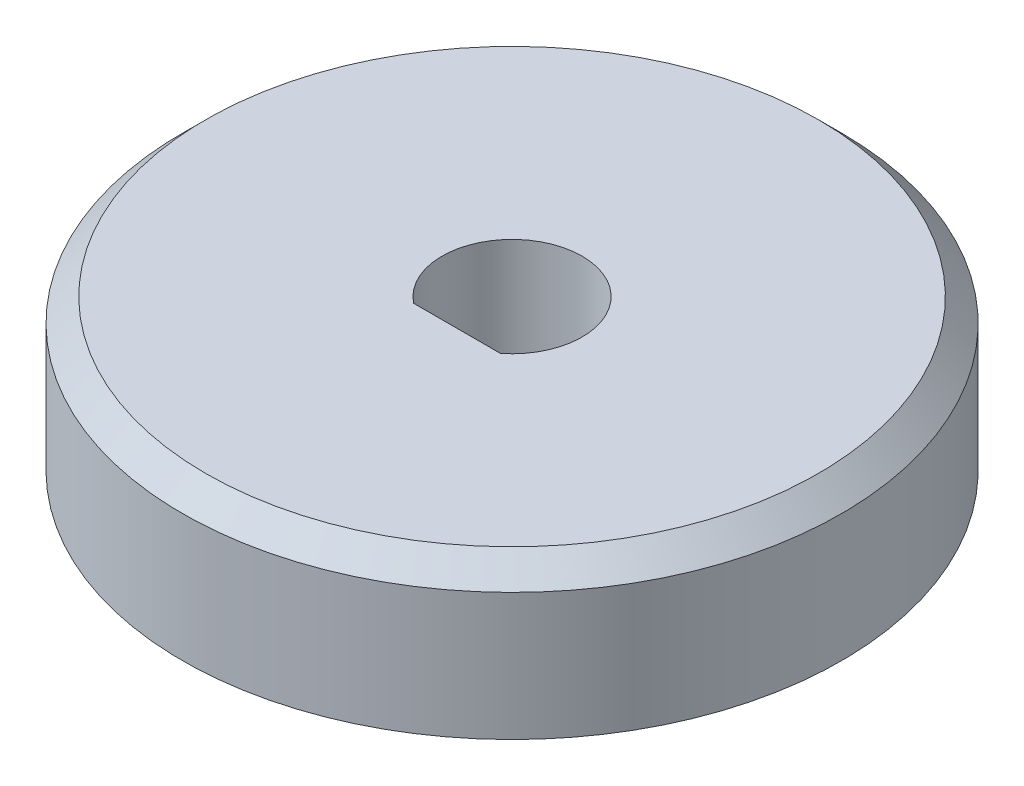
ISO-10303-21;
HEADER;
FILE_DESCRIPTION(('STEP AP214'),'2;1');
FILE_NAME('part.step','',(''),(''),'','','');
FILE_SCHEMA(('AUTOMOTIVE_DESIGN { 1 0 10303 214 1 1 1 1 }'));
ENDSEC;
DATA;
#1=APPLICATION_CONTEXT('core data for automotive mechanical design processes');
#2=APPLICATION_PROTOCOL_DEFINITION('international standard','automotive_design',2000,#1);
#3=PRODUCT_CONTEXT('',#1,'mechanical');
#4=PRODUCT('Part','Part','',(#3));
#5=PRODUCT_RELATED_PRODUCT_CATEGORY('part','',(#4));
#6=PRODUCT_DEFINITION_FORMATION('','',#4);
#7=PRODUCT_DEFINITION_CONTEXT('part definition',#1,'design');
#8=PRODUCT_DEFINITION('design','',#6,#7);
#9=PRODUCT_DEFINITION_SHAPE('','',#8);
#10=(LENGTH_UNIT() NAMED_UNIT(*) SI_UNIT(.MILLI.,.METRE.));
#11=(NAMED_UNIT(*) PLANE_ANGLE_UNIT() SI_UNIT($,.RADIAN.));
#12=(NAMED_UNIT(*) SI_UNIT($,.STERADIAN.) SOLID_ANGLE_UNIT());
#13=UNCERTAINTY_MEASURE_WITH_UNIT(LENGTH_MEASURE(1.E-05),#10,'distance_accuracy_value','');
#14=(GEOMETRIC_REPRESENTATION_CONTEXT(3) GLOBAL_UNCERTAINTY_ASSIGNED_CONTEXT((#13)) GLOBAL_UNIT_ASSIGNED_CONTEXT((#10,
#11,#12)) REPRESENTATION_CONTEXT('',''));
#15=CARTESIAN_POINT('',(0.,0.,0.));
#16=DIRECTION('',(0.,0.,1.));
#17=DIRECTION('',(1.,0.,0.));
#18=AXIS2_PLACEMENT_3D('',#15,#16,#17);
#19=CARTESIAN_POINT('',(0.,6.5,0.));
#20=DIRECTION('',(0.,1.,0.));
#21=DIRECTION('',(0.,0.,1.));
#22=AXIS2_PLACEMENT_3D('',#19,#20,#21);
#23=PLANE('',#22);
#24=CARTESIAN_POINT('',(0.,6.5,0.));
#25=DIRECTION('',(0.,1.,0.));
#26=DIRECTION('',(0.,0.,1.));
#27=AXIS2_PLACEMENT_3D('',#24,#25,#26);
#28=CIRCLE('',#27,13.225);
#29=CARTESIAN_POINT('',(0.,6.5,13.225));
#30=VERTEX_POINT('',#29);
#31=EDGE_CURVE('E41',#30,#30,#28,.T.);
#32=ORIENTED_EDGE('',*,*,#31,.T.);
#33=EDGE_LOOP('',(#32));
#34=FACE_BOUND('',#33,.T.);
#35=DIRECTION('',(1.,0.,0.));
#36=VECTOR('',#35,1.);
#37=CARTESIAN_POINT('',(-1.87349939951952,6.5,2.375));
#38=LINE('',#37,#36);
#39=CARTESIAN_POINT('',(-1.87349939951952,6.5,2.375));
#40=VERTEX_POINT('',#39);
#41=CARTESIAN_POINT('',(1.87349939951952,6.5,2.375));
#42=VERTEX_POINT('',#41);
#43=EDGE_CURVE('E75',#40,#42,#38,.T.);
#44=ORIENTED_EDGE('',*,*,#43,.F.);
#45=CARTESIAN_POINT('',(0.,6.5,0.));
#46=DIRECTION('',(0.,1.,0.));
#47=DIRECTION('',(0.,0.,1.));
#48=AXIS2_PLACEMENT_3D('',#45,#46,#47);
#49=CIRCLE('',#48,3.025);
#50=EDGE_CURVE('E65',#42,#40,#49,.T.);
#51=ORIENTED_EDGE('',*,*,#50,.F.);
#52=EDGE_LOOP('',(#44,#51));
#53=FACE_BOUND('',#52,.T.);
#54=ADVANCED_FACE('F33',(#34,#53),#23,.T.);
#55=CARTESIAN_POINT('',(0.,0.,0.));
#56=DIRECTION('',(0.,1.,0.));
#57=DIRECTION('',(0.,0.,1.));
#58=AXIS2_PLACEMENT_3D('',#55,#56,#57);
#59=PLANE('',#58);
#60=CARTESIAN_POINT('',(0.,0.,0.));
#61=DIRECTION('',(0.,1.,0.));
#62=DIRECTION('',(0.,0.,1.));
#63=AXIS2_PLACEMENT_3D('',#60,#61,#62);
#64=CIRCLE('',#63,14.225);
#65=CARTESIAN_POINT('',(0.,0.,-14.225));
#66=VERTEX_POINT('',#65);
#67=EDGE_CURVE('E70',#66,#66,#64,.T.);
#68=ORIENTED_EDGE('',*,*,#67,.F.);
#69=EDGE_LOOP('',(#68));
#70=FACE_BOUND('',#69,.T.);
#71=CARTESIAN_POINT('',(0.,0.,0.));
#72=DIRECTION('',(0.,1.,0.));
#73=DIRECTION('',(0.,0.,1.));
#74=AXIS2_PLACEMENT_3D('',#71,#72,#73);
#75=CIRCLE('',#74,3.025);
#76=CARTESIAN_POINT('',(1.87349939951952,0.,2.375));
#77=VERTEX_POINT('',#76);
#78=CARTESIAN_POINT('',(-1.87349939951952,0.,2.375));
#79=VERTEX_POINT('',#78);
#80=EDGE_CURVE('E55',#77,#79,#75,.T.);
#81=ORIENTED_EDGE('',*,*,#80,.T.);
#82=DIRECTION('',(1.,0.,0.));
#83=VECTOR('',#82,1.);
#84=CARTESIAN_POINT('',(-1.87349939951952,0.,2.375));
#85=LINE('',#84,#83);
#86=EDGE_CURVE('E61',#79,#77,#85,.T.);
#87=ORIENTED_EDGE('',*,*,#86,.T.);
#88=EDGE_LOOP('',(#81,#87));
#89=FACE_BOUND('',#88,.T.);
#90=ADVANCED_FACE('F72',(#70,#89),#59,.F.);
#91=CARTESIAN_POINT('',(0.,6.5,0.));
#92=DIRECTION('',(0.,-1.,0.));
#93=DIRECTION('',(0.,0.,-1.));
#94=AXIS2_PLACEMENT_3D('',#91,#92,#93);
#95=CYLINDRICAL_SURFACE('',#94,14.225);
#96=CARTESIAN_POINT('',(0.,5.50000000000001,0.));
#97=DIRECTION('',(0.,1.,0.));
#98=DIRECTION('',(0.,0.,1.));
#99=AXIS2_PLACEMENT_3D('',#96,#97,#98);
#100=CIRCLE('',#99,14.225);
#101=CARTESIAN_POINT('',(0.,5.50000000000001,-14.225));
#102=VERTEX_POINT('',#101);
#103=EDGE_CURVE('E11',#102,#102,#100,.F.);
#104=CARTESIAN_POINT('',(0.,5.50000000000001,-14.225));
#105=CARTESIAN_POINT('',(0.,5.44270833333334,-14.225));
#106=CARTESIAN_POINT('',(0.,5.38541666666667,-14.225));
#107=CARTESIAN_POINT('',(0.,5.27083333333334,-14.225));
#108=CARTESIAN_POINT('',(0.,5.21354166666667,-14.225));
#109=CARTESIAN_POINT('',(0.,5.09895833333334,-14.225));
#110=CARTESIAN_POINT('',(0.,5.04166666666667,-14.225));
#111=CARTESIAN_POINT('',(0.,4.92708333333334,-14.225));
#112=CARTESIAN_POINT('',(0.,4.86979166666667,-14.225));
#113=CARTESIAN_POINT('',(0.,4.75520833333334,-14.225));
#114=CARTESIAN_POINT('',(0.,4.69791666666667,-14.225));
#115=CARTESIAN_POINT('',(0.,4.58333333333334,-14.225));
#116=CARTESIAN_POINT('',(0.,4.52604166666667,-14.225));
#117=CARTESIAN_POINT('',(0.,4.41145833333334,-14.225));
#118=CARTESIAN_POINT('',(0.,4.35416666666667,-14.225));
#119=CARTESIAN_POINT('',(0.,4.23958333333334,-14.225));
#120=CARTESIAN_POINT('',(0.,4.18229166666667,-14.225));
#121=CARTESIAN_POINT('',(0.,4.06770833333334,-14.225));
#122=CARTESIAN_POINT('',(0.,4.01041666666667,-14.225));
#123=CARTESIAN_POINT('',(0.,3.89583333333334,-14.225));
#124=CARTESIAN_POINT('',(0.,3.83854166666667,-14.225));
#125=CARTESIAN_POINT('',(0.,3.72395833333334,-14.225));
#126=CARTESIAN_POINT('',(0.,3.66666666666667,-14.225));
#127=CARTESIAN_POINT('',(0.,3.55208333333334,-14.225));
#128=CARTESIAN_POINT('',(0.,3.49479166666667,-14.225));
#129=CARTESIAN_POINT('',(0.,3.38020833333334,-14.225));
#130=CARTESIAN_POINT('',(0.,3.32291666666667,-14.225));
#131=CARTESIAN_POINT('',(0.,3.20833333333334,-14.225));
#132=CARTESIAN_POINT('',(0.,3.15104166666667,-14.225));
#133=CARTESIAN_POINT('',(0.,3.03645833333334,-14.225));
#134=CARTESIAN_POINT('',(0.,2.97916666666667,-14.225));
#135=CARTESIAN_POINT('',(0.,2.86458333333334,-14.225));
#136=CARTESIAN_POINT('',(0.,2.80729166666667,-14.225));
#137=CARTESIAN_POINT('',(0.,2.69270833333334,-14.225));
#138=CARTESIAN_POINT('',(0.,2.63541666666667,-14.225));
#139=CARTESIAN_POINT('',(0.,2.52083333333334,-14.225));
#140=CARTESIAN_POINT('',(0.,2.46354166666667,-14.225));
#141=CARTESIAN_POINT('',(0.,2.34895833333334,-14.225));
#142=CARTESIAN_POINT('',(0.,2.29166666666667,-14.225));
#143=CARTESIAN_POINT('',(0.,2.17708333333334,-14.225));
#144=CARTESIAN_POINT('',(0.,2.11979166666667,-14.225));
#145=CARTESIAN_POINT('',(0.,2.00520833333334,-14.225));
#146=CARTESIAN_POINT('',(0.,1.94791666666667,-14.225));
#147=CARTESIAN_POINT('',(0.,1.83333333333334,-14.225));
#148=CARTESIAN_POINT('',(0.,1.77604166666667,-14.225));
#149=CARTESIAN_POINT('',(0.,1.66145833333333,-14.225));
#150=CARTESIAN_POINT('',(0.,1.60416666666667,-14.225));
#151=CARTESIAN_POINT('',(0.,1.48958333333333,-14.225));
#152=CARTESIAN_POINT('',(0.,1.43229166666667,-14.225));
#153=CARTESIAN_POINT('',(0.,1.31770833333333,-14.225));
#154=CARTESIAN_POINT('',(0.,1.26041666666667,-14.225));
#155=CARTESIAN_POINT('',(0.,1.14583333333333,-14.225));
#156=CARTESIAN_POINT('',(0.,1.08854166666667,-14.225));
#157=CARTESIAN_POINT('',(0.,0.973958333333334,-14.225));
#158=CARTESIAN_POINT('',(0.,0.916666666666668,-14.225));
#159=CARTESIAN_POINT('',(0.,0.802083333333334,-14.225));
#160=CARTESIAN_POINT('',(0.,0.744791666666667,-14.225));
#161=CARTESIAN_POINT('',(0.,0.630208333333334,-14.225));
#162=CARTESIAN_POINT('',(0.,0.572916666666667,-14.225));
#163=CARTESIAN_POINT('',(0.,0.458333333333334,-14.225));
#164=CARTESIAN_POINT('',(0.,0.401041666666667,-14.225));
#165=CARTESIAN_POINT('',(0.,0.286458333333334,-14.225));
#166=CARTESIAN_POINT('',(0.,0.229166666666667,-14.225));
#167=CARTESIAN_POINT('',(0.,0.114583333333333,-14.225));
#168=CARTESIAN_POINT('',(0.,0.0572916666666668,-14.225));
#169=CARTESIAN_POINT('',(0.,0.,-14.225));
#170=B_SPLINE_CURVE_WITH_KNOTS('',3,(#104,#105,#106,#107,#108,#109,#110,#111,#112,#113,#114,
#115,#116,#117,#118,#119,#120,#121,#122,#123,#124,#125,#126,#127,#128,#129,#130,#131,#132,#133,
#134,#135,#136,#137,#138,#139,#140,#141,#142,#143,#144,#145,#146,#147,#148,#149,#150,#151,#152,
#153,#154,#155,#156,#157,#158,#159,#160,#161,#162,#163,#164,#165,#166,#167,#168,#169),
.UNSPECIFIED.,.F.,.F.,(4,2,2,2,2,2,2,2,2,2,2,2,2,2,2,2,2,2,2,2,2,2,2,2,2,2,2,2,2,2,2,2,4),(0.,
0.171875,0.343750000000001,0.515625000000001,0.687500000000001,0.859375000000002,1.03125,
1.203125,1.375,1.546875,1.71875,1.890625,2.0625,2.234375,2.40625,2.578125,2.75,2.921875,3.09375,
3.265625,3.4375,3.609375,3.78125000000001,3.95312500000001,4.12500000000001,4.29687500000001,
4.46875000000001,4.64062500000001,4.81250000000001,4.98437500000001,5.15625000000001,
5.32812500000001,5.50000000000001),.UNSPECIFIED.);
#171=EDGE_CURVE('BSEAM97',#102,#66,#170,.T.);
#172=ORIENTED_EDGE('',*,*,#103,.T.);
#173=ORIENTED_EDGE('',*,*,#67,.T.);
#174=ORIENTED_EDGE('',*,*,#171,.T.);
#175=ORIENTED_EDGE('',*,*,#171,.F.);
#176=EDGE_LOOP('',(#172,#174,#173,#175));
#177=FACE_BOUND('',#176,.T.);
#178=ADVANCED_FACE('F97',(#177),#95,.T.);
#179=CARTESIAN_POINT('',(0.,6.5,0.));
#180=DIRECTION('',(0.,-1.,0.));
#181=DIRECTION('',(0.,0.,-1.));
#182=AXIS2_PLACEMENT_3D('',#179,#180,#181);
#183=CYLINDRICAL_SURFACE('',#182,3.025);
#184=ORIENTED_EDGE('',*,*,#80,.F.);
#185=DIRECTION('',(0.,-1.,0.));
#186=VECTOR('',#185,1.);
#187=CARTESIAN_POINT('',(1.87349939951952,6.5,2.375));
#188=LINE('',#187,#186);
#189=EDGE_CURVE('E63',#42,#77,#188,.T.);
#190=ORIENTED_EDGE('',*,*,#189,.F.);
#191=ORIENTED_EDGE('',*,*,#50,.T.);
#192=DIRECTION('',(0.,-1.,0.));
#193=VECTOR('',#192,1.);
#194=CARTESIAN_POINT('',(-1.87349939951952,6.5,2.375));
#195=LINE('',#194,#193);
#196=EDGE_CURVE('E48',#40,#79,#195,.T.);
#197=ORIENTED_EDGE('',*,*,#196,.T.);
#198=EDGE_LOOP('',(#184,#190,#191,#197));
#199=FACE_BOUND('',#198,.T.);
#200=ADVANCED_FACE('F67',(#199),#183,.F.);
#201=CARTESIAN_POINT('',(-1.87349939951952,6.5,2.375));
#202=DIRECTION('',(0.,0.,-1.));
#203=DIRECTION('',(-1.,0.,0.));
#204=AXIS2_PLACEMENT_3D('',#201,#202,#203);
#205=PLANE('',#204);
#206=ORIENTED_EDGE('',*,*,#86,.F.);
#207=ORIENTED_EDGE('',*,*,#196,.F.);
#208=ORIENTED_EDGE('',*,*,#43,.T.);
#209=ORIENTED_EDGE('',*,*,#189,.T.);
#210=EDGE_LOOP('',(#206,#207,#208,#209));
#211=FACE_BOUND('',#210,.T.);
#212=ADVANCED_FACE('F62',(#211),#205,.T.);
#213=CARTESIAN_POINT('',(0.,6.5,0.));
#214=DIRECTION('',(0.,-1.,0.));
#215=DIRECTION('',(0.,0.,-1.));
#216=AXIS2_PLACEMENT_3D('',#213,#214,#215);
#217=CONICAL_SURFACE('',#216,13.225,0.785398163397448);
#218=ORIENTED_EDGE('',*,*,#103,.F.);
#219=EDGE_LOOP('',(#218));
#220=FACE_BOUND('',#219,.T.);
#221=ORIENTED_EDGE('',*,*,#31,.F.);
#222=EDGE_LOOP('',(#221));
#223=FACE_BOUND('',#222,.T.);
#224=ADVANCED_FACE('F35',(#220,#223),#217,.T.);
#225=CLOSED_SHELL('',(#54,#90,#178,#200,#212,#224));
#226=MANIFOLD_SOLID_BREP('B2',#225);
#227=ADVANCED_BREP_SHAPE_REPRESENTATION('',(#18,#226),#14);
#228=SHAPE_DEFINITION_REPRESENTATION(#9,#227);
ENDSEC;
END-ISO-10303-21;
